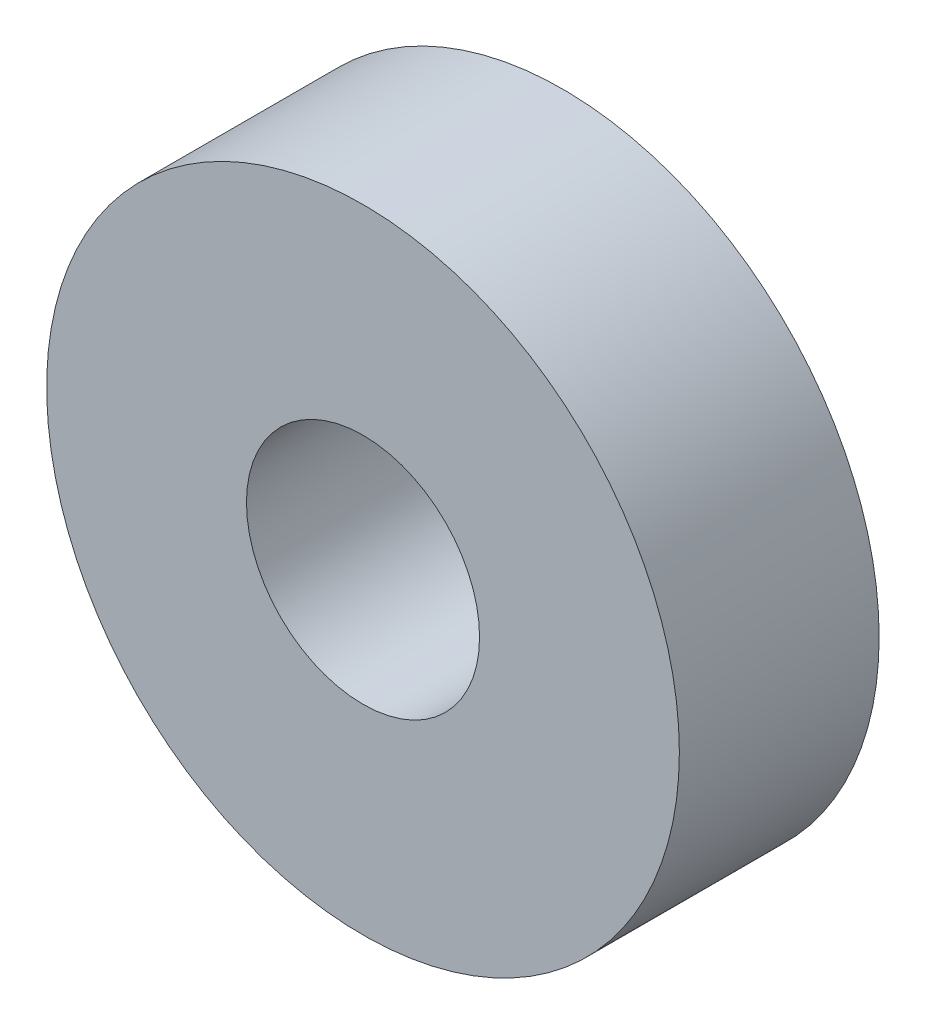
ISO-10303-21;
HEADER;
FILE_DESCRIPTION(('STEP AP214'),'2;1');
FILE_NAME('part.step','',(''),(''),'','','');
FILE_SCHEMA(('AUTOMOTIVE_DESIGN { 1 0 10303 214 1 1 1 1 }'));
ENDSEC;
DATA;
#1=APPLICATION_CONTEXT('core data for automotive mechanical design processes');
#2=APPLICATION_PROTOCOL_DEFINITION('international standard','automotive_design',2000,#1);
#3=PRODUCT_CONTEXT('',#1,'mechanical');
#4=PRODUCT('Part','Part','',(#3));
#5=PRODUCT_RELATED_PRODUCT_CATEGORY('part','',(#4));
#6=PRODUCT_DEFINITION_FORMATION('','',#4);
#7=PRODUCT_DEFINITION_CONTEXT('part definition',#1,'design');
#8=PRODUCT_DEFINITION('design','',#6,#7);
#9=PRODUCT_DEFINITION_SHAPE('','',#8);
#10=(LENGTH_UNIT() NAMED_UNIT(*) SI_UNIT(.MILLI.,.METRE.));
#11=(NAMED_UNIT(*) PLANE_ANGLE_UNIT() SI_UNIT($,.RADIAN.));
#12=(NAMED_UNIT(*) SI_UNIT($,.STERADIAN.) SOLID_ANGLE_UNIT());
#13=UNCERTAINTY_MEASURE_WITH_UNIT(LENGTH_MEASURE(1.E-05),#10,'distance_accuracy_value','');
#14=(GEOMETRIC_REPRESENTATION_CONTEXT(3) GLOBAL_UNCERTAINTY_ASSIGNED_CONTEXT((#13)) GLOBAL_UNIT_ASSIGNED_CONTEXT((#10,
#11,#12)) REPRESENTATION_CONTEXT('',''));
#15=CARTESIAN_POINT('',(0.,0.,0.));
#16=DIRECTION('',(0.,0.,1.));
#17=DIRECTION('',(1.,0.,0.));
#18=AXIS2_PLACEMENT_3D('',#15,#16,#17);
#19=CARTESIAN_POINT('',(0.,0.,6.));
#20=DIRECTION('',(0.,0.,1.));
#21=DIRECTION('',(1.,0.,0.));
#22=AXIS2_PLACEMENT_3D('',#19,#20,#21);
#23=PLANE('',#22);
#24=CARTESIAN_POINT('',(0.,0.,6.));
#25=DIRECTION('',(0.,0.,1.));
#26=DIRECTION('',(1.,0.,0.));
#27=AXIS2_PLACEMENT_3D('',#24,#25,#26);
#28=CIRCLE('',#27,9.5);
#29=CARTESIAN_POINT('',(9.5,0.,6.));
#30=VERTEX_POINT('',#29);
#31=EDGE_CURVE('E10',#30,#30,#28,.T.);
#32=ORIENTED_EDGE('',*,*,#31,.T.);
#33=EDGE_LOOP('',(#32));
#34=FACE_BOUND('',#33,.T.);
#35=CARTESIAN_POINT('',(0.,0.,6.));
#36=DIRECTION('',(0.,0.,1.));
#37=DIRECTION('',(1.,0.,0.));
#38=AXIS2_PLACEMENT_3D('',#35,#36,#37);
#39=CIRCLE('',#38,3.5);
#40=CARTESIAN_POINT('',(3.5,0.,6.));
#41=VERTEX_POINT('',#40);
#42=EDGE_CURVE('E56',#41,#41,#39,.T.);
#43=ORIENTED_EDGE('',*,*,#42,.F.);
#44=EDGE_LOOP('',(#43));
#45=FACE_BOUND('',#44,.T.);
#46=ADVANCED_FACE('F43',(#34,#45),#23,.T.);
#47=CARTESIAN_POINT('',(0.,0.,0.));
#48=DIRECTION('',(0.,0.,1.));
#49=DIRECTION('',(1.,0.,0.));
#50=AXIS2_PLACEMENT_3D('',#47,#48,#49);
#51=PLANE('',#50);
#52=CARTESIAN_POINT('',(0.,0.,0.));
#53=DIRECTION('',(0.,0.,1.));
#54=DIRECTION('',(1.,0.,0.));
#55=AXIS2_PLACEMENT_3D('',#52,#53,#54);
#56=CIRCLE('',#55,9.5);
#57=CARTESIAN_POINT('',(9.5,0.,0.));
#58=VERTEX_POINT('',#57);
#59=EDGE_CURVE('E47',#58,#58,#56,.T.);
#60=ORIENTED_EDGE('',*,*,#59,.F.);
#61=EDGE_LOOP('',(#60));
#62=FACE_BOUND('',#61,.T.);
#63=CARTESIAN_POINT('',(0.,0.,0.));
#64=DIRECTION('',(0.,0.,1.));
#65=DIRECTION('',(1.,0.,0.));
#66=AXIS2_PLACEMENT_3D('',#63,#64,#65);
#67=CIRCLE('',#66,3.5);
#68=CARTESIAN_POINT('',(3.5,0.,0.));
#69=VERTEX_POINT('',#68);
#70=EDGE_CURVE('E58',#69,#69,#67,.T.);
#71=ORIENTED_EDGE('',*,*,#70,.T.);
#72=EDGE_LOOP('',(#71));
#73=FACE_BOUND('',#72,.T.);
#74=ADVANCED_FACE('F70',(#62,#73),#51,.F.);
#75=CARTESIAN_POINT('',(0.,0.,6.));
#76=DIRECTION('',(0.,0.,-1.));
#77=DIRECTION('',(-1.,0.,0.));
#78=AXIS2_PLACEMENT_3D('',#75,#76,#77);
#79=CYLINDRICAL_SURFACE('',#78,9.5);
#80=ORIENTED_EDGE('',*,*,#31,.F.);
#81=EDGE_LOOP('',(#80));
#82=FACE_BOUND('',#81,.T.);
#83=ORIENTED_EDGE('',*,*,#59,.T.);
#84=EDGE_LOOP('',(#83));
#85=FACE_BOUND('',#84,.T.);
#86=ADVANCED_FACE('F45',(#82,#85),#79,.T.);
#87=CARTESIAN_POINT('',(0.,0.,6.));
#88=DIRECTION('',(0.,0.,-1.));
#89=DIRECTION('',(-1.,0.,0.));
#90=AXIS2_PLACEMENT_3D('',#87,#88,#89);
#91=CYLINDRICAL_SURFACE('',#90,3.5);
#92=ORIENTED_EDGE('',*,*,#42,.T.);
#93=EDGE_LOOP('',(#92));
#94=FACE_BOUND('',#93,.T.);
#95=ORIENTED_EDGE('',*,*,#70,.F.);
#96=EDGE_LOOP('',(#95));
#97=FACE_BOUND('',#96,.T.);
#98=ADVANCED_FACE('F66',(#94,#97),#91,.F.);
#99=CLOSED_SHELL('',(#46,#74,#86,#98));
#100=MANIFOLD_SOLID_BREP('B2',#99);
#101=ADVANCED_BREP_SHAPE_REPRESENTATION('',(#18,#100),#14);
#102=SHAPE_DEFINITION_REPRESENTATION(#9,#101);
ENDSEC;
END-ISO-10303-21;
